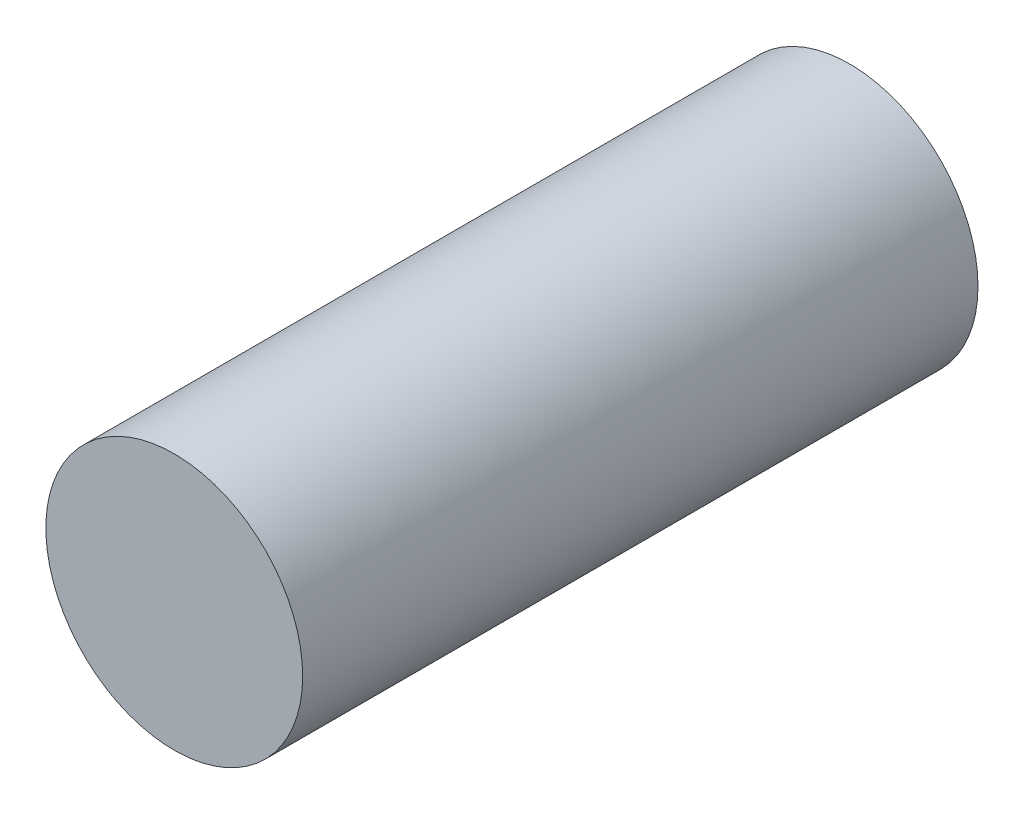
ISO-10303-21;
HEADER;
FILE_DESCRIPTION(('STEP AP214'),'2;1');
FILE_NAME('part.step','',(''),(''),'','','');
FILE_SCHEMA(('AUTOMOTIVE_DESIGN { 1 0 10303 214 1 1 1 1 }'));
ENDSEC;
DATA;
#1=APPLICATION_CONTEXT('core data for automotive mechanical design processes');
#2=APPLICATION_PROTOCOL_DEFINITION('international standard','automotive_design',2000,#1);
#3=PRODUCT_CONTEXT('',#1,'mechanical');
#4=PRODUCT('Part','Part','',(#3));
#5=PRODUCT_RELATED_PRODUCT_CATEGORY('part','',(#4));
#6=PRODUCT_DEFINITION_FORMATION('','',#4);
#7=PRODUCT_DEFINITION_CONTEXT('part definition',#1,'design');
#8=PRODUCT_DEFINITION('design','',#6,#7);
#9=PRODUCT_DEFINITION_SHAPE('','',#8);
#10=(LENGTH_UNIT() NAMED_UNIT(*) SI_UNIT(.MILLI.,.METRE.));
#11=(NAMED_UNIT(*) PLANE_ANGLE_UNIT() SI_UNIT($,.RADIAN.));
#12=(NAMED_UNIT(*) SI_UNIT($,.STERADIAN.) SOLID_ANGLE_UNIT());
#13=UNCERTAINTY_MEASURE_WITH_UNIT(LENGTH_MEASURE(1.E-05),#10,'distance_accuracy_value','');
#14=(GEOMETRIC_REPRESENTATION_CONTEXT(3) GLOBAL_UNCERTAINTY_ASSIGNED_CONTEXT((#13)) GLOBAL_UNIT_ASSIGNED_CONTEXT((#10,
#11,#12)) REPRESENTATION_CONTEXT('',''));
#15=CARTESIAN_POINT('',(0.,0.,0.));
#16=DIRECTION('',(0.,0.,1.));
#17=DIRECTION('',(1.,0.,0.));
#18=AXIS2_PLACEMENT_3D('',#15,#16,#17);
#19=CARTESIAN_POINT('',(0.,0.,9.017));
#20=DIRECTION('',(0.,0.,-1.));
#21=DIRECTION('',(-1.,0.,0.));
#22=AXIS2_PLACEMENT_3D('',#19,#20,#21);
#23=CYLINDRICAL_SURFACE('',#22,1.7145);
#24=CARTESIAN_POINT('',(0.,0.,9.017));
#25=DIRECTION('',(0.,0.,1.));
#26=DIRECTION('',(1.,0.,0.));
#27=AXIS2_PLACEMENT_3D('',#24,#25,#26);
#28=CIRCLE('',#27,1.7145);
#29=CARTESIAN_POINT('',(1.7145,0.,9.017));
#30=VERTEX_POINT('',#29);
#31=EDGE_CURVE('E10',#30,#30,#28,.T.);
#32=ORIENTED_EDGE('',*,*,#31,.F.);
#33=EDGE_LOOP('',(#32));
#34=FACE_BOUND('',#33,.T.);
#35=CARTESIAN_POINT('',(0.,0.,0.));
#36=DIRECTION('',(0.,0.,1.));
#37=DIRECTION('',(1.,0.,0.));
#38=AXIS2_PLACEMENT_3D('',#35,#36,#37);
#39=CIRCLE('',#38,1.7145);
#40=CARTESIAN_POINT('',(1.7145,0.,0.));
#41=VERTEX_POINT('',#40);
#42=EDGE_CURVE('E42',#41,#41,#39,.T.);
#43=ORIENTED_EDGE('',*,*,#42,.T.);
#44=EDGE_LOOP('',(#43));
#45=FACE_BOUND('',#44,.T.);
#46=ADVANCED_FACE('F39',(#34,#45),#23,.T.);
#47=CARTESIAN_POINT('',(0.,0.,9.017));
#48=DIRECTION('',(0.,0.,1.));
#49=DIRECTION('',(1.,0.,0.));
#50=AXIS2_PLACEMENT_3D('',#47,#48,#49);
#51=PLANE('',#50);
#52=ORIENTED_EDGE('',*,*,#31,.T.);
#53=EDGE_LOOP('',(#52));
#54=FACE_BOUND('',#53,.T.);
#55=ADVANCED_FACE('F54',(#54),#51,.T.);
#56=CARTESIAN_POINT('',(0.,0.,0.));
#57=DIRECTION('',(0.,0.,1.));
#58=DIRECTION('',(1.,0.,0.));
#59=AXIS2_PLACEMENT_3D('',#56,#57,#58);
#60=PLANE('',#59);
#61=ORIENTED_EDGE('',*,*,#42,.F.);
#62=EDGE_LOOP('',(#61));
#63=FACE_BOUND('',#62,.T.);
#64=ADVANCED_FACE('F52',(#63),#60,.F.);
#65=CLOSED_SHELL('',(#46,#55,#64));
#66=MANIFOLD_SOLID_BREP('B2',#65);
#67=ADVANCED_BREP_SHAPE_REPRESENTATION('',(#18,#66),#14);
#68=SHAPE_DEFINITION_REPRESENTATION(#9,#67);
ENDSEC;
END-ISO-10303-21;
